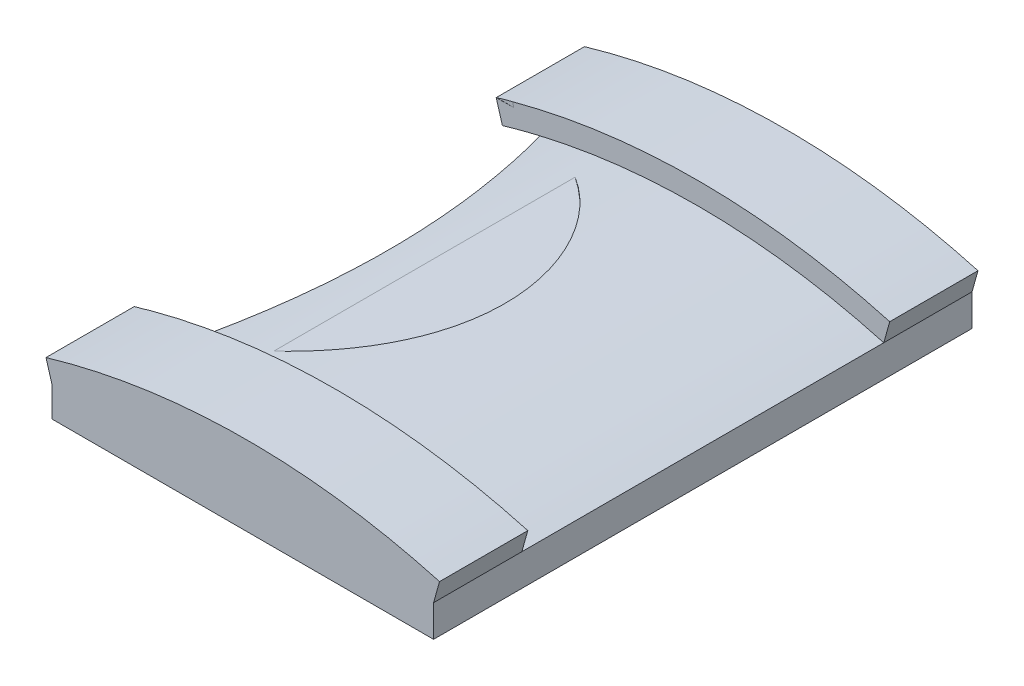
ISO-10303-21;
HEADER;
FILE_DESCRIPTION(('STEP AP214'),'2;1');
FILE_NAME('part.step','',(''),(''),'','','');
FILE_SCHEMA(('AUTOMOTIVE_DESIGN { 1 0 10303 214 1 1 1 1 }'));
ENDSEC;
DATA;
#1=APPLICATION_CONTEXT('core data for automotive mechanical design processes');
#2=APPLICATION_PROTOCOL_DEFINITION('international standard','automotive_design',2000,#1);
#3=PRODUCT_CONTEXT('',#1,'mechanical');
#4=PRODUCT('Part','Part','',(#3));
#5=PRODUCT_RELATED_PRODUCT_CATEGORY('part','',(#4));
#6=PRODUCT_DEFINITION_FORMATION('','',#4);
#7=PRODUCT_DEFINITION_CONTEXT('part definition',#1,'design');
#8=PRODUCT_DEFINITION('design','',#6,#7);
#9=PRODUCT_DEFINITION_SHAPE('','',#8);
#10=(LENGTH_UNIT() NAMED_UNIT(*) SI_UNIT(.MILLI.,.METRE.));
#11=(NAMED_UNIT(*) PLANE_ANGLE_UNIT() SI_UNIT($,.RADIAN.));
#12=(NAMED_UNIT(*) SI_UNIT($,.STERADIAN.) SOLID_ANGLE_UNIT());
#13=UNCERTAINTY_MEASURE_WITH_UNIT(LENGTH_MEASURE(1.E-05),#10,'distance_accuracy_value','');
#14=(GEOMETRIC_REPRESENTATION_CONTEXT(3) GLOBAL_UNCERTAINTY_ASSIGNED_CONTEXT((#13)) GLOBAL_UNIT_ASSIGNED_CONTEXT((#10,
#11,#12)) REPRESENTATION_CONTEXT('',''));
#15=CARTESIAN_POINT('',(0.,0.,0.));
#16=DIRECTION('',(0.,0.,1.));
#17=DIRECTION('',(1.,0.,0.));
#18=AXIS2_PLACEMENT_3D('',#15,#16,#17);
#19=CARTESIAN_POINT('',(-89.8245481772572,-2.61117872608306,610.));
#20=DIRECTION('',(0.,1.,0.));
#21=DIRECTION('',(0.,0.,1.));
#22=AXIS2_PLACEMENT_3D('',#19,#20,#21);
#23=PLANE('',#22);
#24=DIRECTION('',(1.,0.,0.));
#25=VECTOR('',#24,1.);
#26=CARTESIAN_POINT('',(-89.8245481772572,-2.61117872608306,610.));
#27=LINE('',#26,#25);
#28=CARTESIAN_POINT('',(-89.8245481772572,-2.61117872608307,610.));
#29=VERTEX_POINT('',#28);
#30=CARTESIAN_POINT('',(342.175451822743,-2.61117872608306,610.));
#31=VERTEX_POINT('',#30);
#32=EDGE_CURVE('E204',#29,#31,#27,.T.);
#33=ORIENTED_EDGE('',*,*,#32,.F.);
#34=CARTESIAN_POINT('',(-665.894968130585,-2.61117872608307,305.));
#35=DIRECTION('',(0.,1.,0.));
#36=DIRECTION('',(0.,0.,1.));
#37=AXIS2_PLACEMENT_3D('',#34,#35,#36);
#38=CIRCLE('',#37,651.829831125581);
#39=CARTESIAN_POINT('',(-89.8245481772572,-2.61117872608307,0.));
#40=VERTEX_POINT('',#39);
#41=EDGE_CURVE('E198',#29,#40,#38,.T.);
#42=ORIENTED_EDGE('',*,*,#41,.T.);
#43=DIRECTION('',(1.,0.,0.));
#44=VECTOR('',#43,1.);
#45=CARTESIAN_POINT('',(-89.8245481772572,-2.61117872608306,0.));
#46=LINE('',#45,#44);
#47=CARTESIAN_POINT('',(342.175451822743,-2.61117872608306,0.));
#48=VERTEX_POINT('',#47);
#49=EDGE_CURVE('E211',#40,#48,#46,.T.);
#50=ORIENTED_EDGE('',*,*,#49,.T.);
#51=DIRECTION('',(0.,0.,-1.));
#52=VECTOR('',#51,1.);
#53=CARTESIAN_POINT('',(342.175451822743,-2.61117872608306,610.));
#54=LINE('',#53,#52);
#55=EDGE_CURVE('E209',#31,#48,#54,.T.);
#56=ORIENTED_EDGE('',*,*,#55,.F.);
#57=EDGE_LOOP('',(#33,#42,#50,#56));
#58=FACE_BOUND('',#57,.T.);
#59=ADVANCED_FACE('F39',(#58),#23,.F.);
#60=CARTESIAN_POINT('',(342.175451822743,33.3888212739169,610.));
#61=DIRECTION('',(-1.,0.,0.));
#62=DIRECTION('',(0.,0.,1.));
#63=AXIS2_PLACEMENT_3D('',#60,#61,#62);
#64=PLANE('',#63);
#65=DIRECTION('',(0.,1.,0.));
#66=VECTOR('',#65,1.);
#67=CARTESIAN_POINT('',(342.175451822743,33.3888212739169,0.));
#68=LINE('',#67,#66);
#69=CARTESIAN_POINT('',(342.175451822743,33.3888212739169,0.));
#70=VERTEX_POINT('',#69);
#71=EDGE_CURVE('E205',#48,#70,#68,.T.);
#72=ORIENTED_EDGE('',*,*,#71,.T.);
#73=DIRECTION('',(0.,0.,1.));
#74=VECTOR('',#73,1.);
#75=CARTESIAN_POINT('',(342.175451822743,33.3888212739169,0.));
#76=LINE('',#75,#74);
#77=CARTESIAN_POINT('',(342.175451822743,33.3888212739169,100.));
#78=VERTEX_POINT('',#77);
#79=EDGE_CURVE('E195',#70,#78,#76,.T.);
#80=ORIENTED_EDGE('',*,*,#79,.T.);
#81=CARTESIAN_POINT('',(342.175451822743,33.3888212739169,510.));
#82=VERTEX_POINT('',#81);
#83=EDGE_CURVE('E192',#78,#82,#76,.T.);
#84=ORIENTED_EDGE('',*,*,#83,.T.);
#85=DIRECTION('',(0.,0.,1.));
#86=VECTOR('',#85,1.);
#87=CARTESIAN_POINT('',(342.175451822743,33.3888212739169,510.));
#88=LINE('',#87,#86);
#89=CARTESIAN_POINT('',(342.175451822743,33.3888212739169,610.));
#90=VERTEX_POINT('',#89);
#91=EDGE_CURVE('E177',#82,#90,#88,.T.);
#92=ORIENTED_EDGE('',*,*,#91,.T.);
#93=DIRECTION('',(0.,1.,0.));
#94=VECTOR('',#93,1.);
#95=CARTESIAN_POINT('',(342.175451822743,-2.61117872608306,610.));
#96=LINE('',#95,#94);
#97=EDGE_CURVE('E207',#31,#90,#96,.T.);
#98=ORIENTED_EDGE('',*,*,#97,.F.);
#99=ORIENTED_EDGE('',*,*,#55,.T.);
#100=EDGE_LOOP('',(#72,#80,#84,#92,#98,#99));
#101=FACE_BOUND('',#100,.T.);
#102=ADVANCED_FACE('F307',(#101),#64,.F.);
#103=CARTESIAN_POINT('',(0.,0.,610.));
#104=DIRECTION('',(0.,0.,1.));
#105=DIRECTION('',(1.,0.,0.));
#106=AXIS2_PLACEMENT_3D('',#103,#104,#105);
#107=PLANE('',#106);
#108=ORIENTED_EDGE('',*,*,#97,.T.);
#109=DIRECTION('',(0.269780541276789,0.962921834599467,0.));
#110=VECTOR('',#109,1.);
#111=CARTESIAN_POINT('',(348.919965354663,57.4618671389037,610.));
#112=LINE('',#111,#110);
#113=CARTESIAN_POINT('',(348.919965354663,57.4618671389037,610.));
#114=VERTEX_POINT('',#113);
#115=EDGE_CURVE('E185',#90,#114,#112,.T.);
#116=ORIENTED_EDGE('',*,*,#115,.T.);
#117=CARTESIAN_POINT('',(131.389708637557,-718.964160059342,610.));
#118=DIRECTION('',(0.,0.,1.));
#119=DIRECTION('',(-1.,0.,0.));
#120=AXIS2_PLACEMENT_3D('',#117,#118,#119);
#121=CIRCLE('',#120,806.32300494173);
#122=CARTESIAN_POINT('',(-96.902742964038,54.3658761089127,610.));
#123=VERTEX_POINT('',#122);
#124=EDGE_CURVE('E188',#114,#123,#121,.T.);
#125=ORIENTED_EDGE('',*,*,#124,.T.);
#126=DIRECTION('',(0.283127791471228,-0.959082193399828,0.));
#127=VECTOR('',#126,1.);
#128=CARTESIAN_POINT('',(-96.902742964038,54.3658761089127,610.));
#129=LINE('',#128,#127);
#130=CARTESIAN_POINT('',(-89.8245481772572,30.3888212739169,610.));
#131=VERTEX_POINT('',#130);
#132=EDGE_CURVE('E168',#123,#131,#129,.T.);
#133=ORIENTED_EDGE('',*,*,#132,.T.);
#134=DIRECTION('',(0.,-1.,0.));
#135=VECTOR('',#134,1.);
#136=CARTESIAN_POINT('',(-89.8245481772572,33.3888212739169,610.));
#137=LINE('',#136,#135);
#138=EDGE_CURVE('E202',#131,#29,#137,.T.);
#139=ORIENTED_EDGE('',*,*,#138,.T.);
#140=ORIENTED_EDGE('',*,*,#32,.T.);
#141=EDGE_LOOP('',(#108,#116,#125,#133,#139,#140));
#142=FACE_BOUND('',#141,.T.);
#143=ADVANCED_FACE('F312',(#142),#107,.T.);
#144=CARTESIAN_POINT('',(0.,0.,0.));
#145=DIRECTION('',(0.,0.,1.));
#146=DIRECTION('',(1.,0.,0.));
#147=AXIS2_PLACEMENT_3D('',#144,#145,#146);
#148=PLANE('',#147);
#149=DIRECTION('',(0.,-1.,0.));
#150=VECTOR('',#149,1.);
#151=CARTESIAN_POINT('',(-89.8245481772572,33.3888212739169,0.));
#152=LINE('',#151,#150);
#153=CARTESIAN_POINT('',(-89.8245481772572,30.388821273917,0.));
#154=VERTEX_POINT('',#153);
#155=EDGE_CURVE('E201',#154,#40,#152,.T.);
#156=ORIENTED_EDGE('',*,*,#155,.F.);
#157=DIRECTION('',(-0.283127791471227,0.959082193399828,0.));
#158=VECTOR('',#157,1.);
#159=CARTESIAN_POINT('',(-89.8245481772572,30.388821273917,0.));
#160=LINE('',#159,#158);
#161=CARTESIAN_POINT('',(-96.9027429640379,54.3658761089127,0.));
#162=VERTEX_POINT('',#161);
#163=EDGE_CURVE('E249',#154,#162,#160,.T.);
#164=ORIENTED_EDGE('',*,*,#163,.T.);
#165=CARTESIAN_POINT('',(131.389708637557,-718.964160059331,0.));
#166=DIRECTION('',(0.,0.,-1.));
#167=DIRECTION('',(1.,0.,0.));
#168=AXIS2_PLACEMENT_3D('',#165,#166,#167);
#169=CIRCLE('',#168,806.323004941719);
#170=CARTESIAN_POINT('',(348.919965354663,57.4618671389037,0.));
#171=VERTEX_POINT('',#170);
#172=EDGE_CURVE('E346',#162,#171,#169,.T.);
#173=ORIENTED_EDGE('',*,*,#172,.T.);
#174=DIRECTION('',(-0.269780541276791,-0.962921834599466,0.));
#175=VECTOR('',#174,1.);
#176=CARTESIAN_POINT('',(348.919965354663,57.4618671389037,0.));
#177=LINE('',#176,#175);
#178=EDGE_CURVE('E343',#171,#70,#177,.T.);
#179=ORIENTED_EDGE('',*,*,#178,.T.);
#180=ORIENTED_EDGE('',*,*,#71,.F.);
#181=ORIENTED_EDGE('',*,*,#49,.F.);
#182=EDGE_LOOP('',(#156,#164,#173,#179,#180,#181));
#183=FACE_BOUND('',#182,.T.);
#184=ADVANCED_FACE('F327',(#183),#148,.F.);
#185=CARTESIAN_POINT('',(-665.894968130585,-546.611178726083,305.));
#186=DIRECTION('',(0.,1.,0.));
#187=DIRECTION('',(0.,0.,1.));
#188=AXIS2_PLACEMENT_3D('',#185,#186,#187);
#189=CYLINDRICAL_SURFACE('',#188,651.829831125581);
#190=ORIENTED_EDGE('',*,*,#138,.F.);
#191=CARTESIAN_POINT('',(-89.8245481772573,30.388821273917,610.));
#192=CARTESIAN_POINT('',(-87.7670274310315,30.9962045677545,606.113875969285));
#193=CARTESIAN_POINT('',(-85.7475453875306,31.583168212301,602.20444718411));
#194=CARTESIAN_POINT('',(-81.7859853736655,32.7179611729695,594.340979217938));
#195=CARTESIAN_POINT('',(-79.8439068621288,33.2657907627213,590.386940349084));
#196=CARTESIAN_POINT('',(-76.038544657114,34.3240031996084,582.436390998146));
#197=CARTESIAN_POINT('',(-74.1752571215654,34.8343878735576,578.439882598915));
#198=CARTESIAN_POINT('',(-70.5286124537981,35.8193822972558,570.406278435235));
#199=CARTESIAN_POINT('',(-68.745255459662,36.2939919852033,566.369182600684));
#200=CARTESIAN_POINT('',(-63.517831279145,37.6663162573753,554.202364127327));
#201=CARTESIAN_POINT('',(-60.1950581372426,38.5128994606391,546.014284820514));
#202=CARTESIAN_POINT('',(-53.8817206385587,40.0817639930959,529.499604411659));
#203=CARTESIAN_POINT('',(-50.8911600808044,40.8040439008667,521.173001726781));
#204=CARTESIAN_POINT('',(-45.253260778214,42.1345698836475,504.409331189197));
#205=CARTESIAN_POINT('',(-42.6054145958622,42.7429851612326,495.972447499082));
#206=CARTESIAN_POINT('',(-37.6535989144778,43.8572078050147,478.991748524664));
#207=CARTESIAN_POINT('',(-35.3496284437111,44.3630154611648,470.447933542604));
#208=CARTESIAN_POINT('',(-31.0903200795063,45.2809741286341,453.268377019372));
#209=CARTESIAN_POINT('',(-29.1350014476571,45.6931199658658,444.632630427267));
#210=CARTESIAN_POINT('',(-25.577176773037,46.4313822043593,427.285133191634));
#211=CARTESIAN_POINT('',(-23.9746709120603,46.7574985612926,418.573382508946));
#212=CARTESIAN_POINT('',(-21.1262694021431,47.32992458623,401.092882548081));
#213=CARTESIAN_POINT('',(-19.8802268103644,47.5762671444792,392.324158284743));
#214=CARTESIAN_POINT('',(-17.7463113049515,47.9942924790657,374.74147729602));
#215=CARTESIAN_POINT('',(-16.8584383238481,48.1659752694669,365.927520579156));
#216=CARTESIAN_POINT('',(-15.4425810664872,48.438235417951,348.269743831603));
#217=CARTESIAN_POINT('',(-14.9145934065414,48.5388134445705,339.425924082476));
#218=CARTESIAN_POINT('',(-14.2195015608316,48.670988422831,321.723603031309));
#219=CARTESIAN_POINT('',(-14.0523973434685,48.7025853805121,312.865101730556));
#220=CARTESIAN_POINT('',(-14.0793894614111,48.6974709549842,295.148862758322));
#221=CARTESIAN_POINT('',(-14.2734779044289,48.660761064323,286.291125074386));
#222=CARTESIAN_POINT('',(-15.0224712908855,48.5182546426919,268.59146716632));
#223=CARTESIAN_POINT('',(-15.5773763840426,48.4124580830549,259.749546948756));
#224=CARTESIAN_POINT('',(-17.0469465592892,48.1295481551083,242.096746904372));
#225=CARTESIAN_POINT('',(-17.9616135352095,47.9524344113762,233.285867241199));
#226=CARTESIAN_POINT('',(-20.1489412448004,47.5232290702746,215.710490218211));
#227=CARTESIAN_POINT('',(-21.4216014415143,47.2711375853648,206.945992788846));
#228=CARTESIAN_POINT('',(-24.3095809655457,46.6894946269283,189.555991413942));
#229=CARTESIAN_POINT('',(-25.9217688880594,46.3606482378295,180.929943797826));
#230=CARTESIAN_POINT('',(-29.4921995180518,45.6180619931893,163.753445974169));
#231=CARTESIAN_POINT('',(-31.4504414716799,45.2043223225807,155.202995601989));
#232=CARTESIAN_POINT('',(-35.7088852884541,44.2844510172382,138.193251270943));
#233=CARTESIAN_POINT('',(-38.0090657857596,43.7783251547543,129.733951651968));
#234=CARTESIAN_POINT('',(-42.9466919166592,42.6649241570146,112.921016082648));
#235=CARTESIAN_POINT('',(-45.5841386302467,42.0576486978559,104.567380470755));
#236=CARTESIAN_POINT('',(-51.1945731518483,40.7311330957676,87.9690994947993));
#237=CARTESIAN_POINT('',(-54.1680400883225,40.0117325062748,79.7246289743764));
#238=CARTESIAN_POINT('',(-60.4407982930746,38.4506149465105,63.3720727451016));
#239=CARTESIAN_POINT('',(-63.7400858753715,37.6088993599272,55.2639854945716));
#240=CARTESIAN_POINT('',(-68.9276442281394,36.2456051853361,43.2152047479861));
#241=CARTESIAN_POINT('',(-70.6969374754253,35.7742941917437,39.2171350867238));
#242=CARTESIAN_POINT('',(-74.3139349363659,34.7965178874559,31.2608833503258));
#243=CARTESIAN_POINT('',(-76.1616390181227,34.290052635894,27.3027012081076));
#244=CARTESIAN_POINT('',(-79.9343439459667,33.2403451392832,19.4280530829188));
#245=CARTESIAN_POINT('',(-81.8593484770165,32.6971011401188,15.5115890999673));
#246=CARTESIAN_POINT('',(-85.7853076513413,31.5721919863455,7.72245949745522));
#247=CARTESIAN_POINT('',(-87.7862628113313,30.9905265703243,3.84979417610277));
#248=CARTESIAN_POINT('',(-89.8245481772572,30.3888212739169,1.52744912544088E-13));
#249=B_SPLINE_CURVE_WITH_KNOTS('',3,(#191,#192,#193,#194,#195,#196,#197,#198,#199,#200,#201,
#202,#203,#204,#205,#206,#207,#208,#209,#210,#211,#212,#213,#214,#215,#216,#217,#218,#219,#220,
#221,#222,#223,#224,#225,#226,#227,#228,#229,#230,#231,#232,#233,#234,#235,#236,#237,#238,#239,
#240,#241,#242,#243,#244,#245,#246,#247,#248),.UNSPECIFIED.,.F.,.F.,(4,2,2,2,2,2,2,2,2,2,2,2,2,
2,2,2,2,2,2,2,2,2,2,2,2,2,2,2,4),(0.,13.3165363844226,26.6329796489681,39.9487728155599,
53.264588984717,79.8867643393502,106.509244101348,133.091843223805,159.674367226935,
186.258359351145,212.842365173285,239.415396577907,265.988422976908,292.561199529444,
319.133973755266,345.706167355998,372.278371982681,398.85071649058,425.423021142632,
451.760219577979,478.097360640572,504.432856732646,530.768437158316,557.142054719575,
583.515373952542,596.706727444244,609.898058747132,623.090019637594,636.282070293012),.UNSPECIFIED.);
#250=CARTESIAN_POINT('',(-47.1404701710119,41.6885946886805,510.));
#251=VERTEX_POINT('',#250);
#252=EDGE_CURVE('E219',#131,#251,#249,.T.);
#253=ORIENTED_EDGE('',*,*,#252,.T.);
#254=CARTESIAN_POINT('',(-47.1404701710119,41.6885946886801,100.));
#255=VERTEX_POINT('',#254);
#256=EDGE_CURVE('E229',#251,#255,#249,.T.);
#257=ORIENTED_EDGE('',*,*,#256,.T.);
#258=EDGE_CURVE('E218',#255,#154,#249,.T.);
#259=ORIENTED_EDGE('',*,*,#258,.T.);
#260=ORIENTED_EDGE('',*,*,#155,.T.);
#261=ORIENTED_EDGE('',*,*,#41,.F.);
#262=EDGE_LOOP('',(#190,#253,#257,#259,#260,#261));
#263=FACE_BOUND('',#262,.T.);
#264=ADVANCED_FACE('F230',(#263),#189,.F.);
#265=CARTESIAN_POINT('',(131.389708637557,-718.964160059315,0.));
#266=DIRECTION('',(0.,0.,1.));
#267=DIRECTION('',(1.,0.,0.));
#268=AXIS2_PLACEMENT_3D('',#265,#266,#267);
#269=CYLINDRICAL_SURFACE('',#268,781.323004941704);
#270=DIRECTION('',(0.,0.,1.));
#271=VECTOR('',#270,1.);
#272=CARTESIAN_POINT('',(26.8316114314814,55.3311598024148,0.));
#273=LINE('',#272,#271);
#274=CARTESIAN_POINT('',(26.8316114314814,55.3311598024147,475.666427399295));
#275=VERTEX_POINT('',#274);
#276=CARTESIAN_POINT('',(26.8316114314814,55.3311598024147,134.333572600705));
#277=VERTEX_POINT('',#276);
#278=EDGE_CURVE('E141',#275,#277,#273,.F.);
#279=ORIENTED_EDGE('',*,*,#278,.T.);
#280=CARTESIAN_POINT('',(19.9150364328104,54.3656761089128,129.909174977745));
#281=CARTESIAN_POINT('',(22.1788123379352,54.6920112220515,131.293418577248));
#282=CARTESIAN_POINT('',(24.4167799901429,55.0044512575286,132.723110170417));
#283=CARTESIAN_POINT('',(28.837345579932,55.6025702743677,135.670880237915));
#284=CARTESIAN_POINT('',(31.019944451999,55.8882497076006,137.188957219093));
#285=CARTESIAN_POINT('',(35.3257044091558,56.4338379565738,140.310751974814));
#286=CARTESIAN_POINT('',(37.4488762319825,56.6937514497581,141.914454123682));
#287=CARTESIAN_POINT('',(41.632652521988,57.1890116364645,145.205113873037));
#288=CARTESIAN_POINT('',(43.6932567635858,57.4243582414207,146.892071773636));
#289=CARTESIAN_POINT('',(47.7467745622145,57.8715060478362,150.345048312508));
#290=CARTESIAN_POINT('',(49.7397430606426,58.0833266938669,152.110999941879));
#291=CARTESIAN_POINT('',(53.6565113999245,58.4849146554839,155.720416617031));
#292=CARTESIAN_POINT('',(55.5803111051449,58.6746819278274,157.563881814794));
#293=CARTESIAN_POINT('',(59.355702617917,59.0334851297347,161.325474857561));
#294=CARTESIAN_POINT('',(61.2072903415262,59.2025198879292,163.24360691312));
#295=CARTESIAN_POINT('',(64.8351481724146,59.5211926724865,167.151392088328));
#296=CARTESIAN_POINT('',(66.6114175804554,59.6708305187992,169.14104587165));
#297=CARTESIAN_POINT('',(70.1842774556156,59.9600500704249,173.303496099533));
#298=CARTESIAN_POINT('',(71.9763099716147,60.0985805763891,175.480280298342));
#299=CARTESIAN_POINT('',(75.4698617852609,60.3571324247925,179.906390722817));
#300=CARTESIAN_POINT('',(77.1713801891605,60.4771535844905,182.155717664428));
#301=CARTESIAN_POINT('',(80.4809133700942,60.7003084886724,186.723053852414));
#302=CARTESIAN_POINT('',(82.0889253639644,60.8034417306631,189.041065140042));
#303=CARTESIAN_POINT('',(85.2085346683646,60.9944154156851,193.741683621457));
#304=CARTESIAN_POINT('',(86.7201322084285,61.0822558951247,196.124290661442));
#305=CARTESIAN_POINT('',(89.6444119459957,61.2442178927159,200.950269706861));
#306=CARTESIAN_POINT('',(91.0570830632053,61.3183378756209,203.393648477655));
#307=CARTESIAN_POINT('',(93.7808365275743,61.4543624267841,208.336717505466));
#308=CARTESIAN_POINT('',(95.091918887971,61.516266996634,210.836407755147));
#309=CARTESIAN_POINT('',(97.6101913777736,61.6293135208904,215.887819008656));
#310=CARTESIAN_POINT('',(98.8173816048716,61.6804554854173,218.439539963556));
#311=CARTESIAN_POINT('',(101.125756555379,61.7733538669978,223.590660030208));
#312=CARTESIAN_POINT('',(102.226940965122,61.8151102562804,226.190059283012));
#313=CARTESIAN_POINT('',(104.339843002094,61.8911915544343,231.478329073538));
#314=CARTESIAN_POINT('',(105.349640598226,61.9253724354437,234.167969044848));
#315=CARTESIAN_POINT('',(107.255629016302,61.9866024540527,239.587291142207));
#316=CARTESIAN_POINT('',(108.151819470779,62.0136515685847,242.316973397743));
#317=CARTESIAN_POINT('',(109.828979061146,62.0617530087277,247.811600756003));
#318=CARTESIAN_POINT('',(110.609946666647,62.082805254692,250.576546326566));
#319=CARTESIAN_POINT('',(112.0552303886,62.1199190452055,256.136789478685));
#320=CARTESIAN_POINT('',(112.71954659824,62.1359805937415,258.932087035993));
#321=CARTESIAN_POINT('',(113.930395235543,62.1639838891103,264.548438918589));
#322=CARTESIAN_POINT('',(114.476913921379,62.1759251553835,267.369496208944));
#323=CARTESIAN_POINT('',(115.451078526767,62.1964095589081,273.032073487896));
#324=CARTESIAN_POINT('',(115.878724442883,62.2049526960611,275.873593477085));
#325=CARTESIAN_POINT('',(116.614367274972,62.2192132426191,281.572082082329));
#326=CARTESIAN_POINT('',(116.922364388528,62.2249306566903,284.429050672867));
#327=CARTESIAN_POINT('',(117.418151998776,62.2339551121418,290.153404069819));
#328=CARTESIAN_POINT('',(117.605942410398,62.2372621518163,293.020788883604));
#329=CARTESIAN_POINT('',(117.86151302807,62.241729843075,298.773018522017));
#330=CARTESIAN_POINT('',(117.928783971798,62.2428813873962,301.657885993406));
#331=CARTESIAN_POINT('',(117.941636067124,62.2431027270987,307.427893569998));
#332=CARTESIAN_POINT('',(117.887217120436,62.2421725207987,310.313033675421));
#333=CARTESIAN_POINT('',(117.656788439789,62.2381557474336,316.078465407829));
#334=CARTESIAN_POINT('',(117.480778179306,62.2350691710308,318.958757013766));
#335=CARTESIAN_POINT('',(117.00748846403,62.2264989906196,324.709355094126));
#336=CARTESIAN_POINT('',(116.710209036992,62.2210153871597,327.579661570834));
#337=CARTESIAN_POINT('',(115.994969005784,62.2072474608332,333.304832863546));
#338=CARTESIAN_POINT('',(115.577023272909,62.198963483072,336.159699538256));
#339=CARTESIAN_POINT('',(114.621200553059,62.1790301658533,341.84927328069));
#340=CARTESIAN_POINT('',(114.083323559826,62.1673808262202,344.683980347362));
#341=CARTESIAN_POINT('',(112.888623487723,62.1399974314325,350.328188055981));
#342=CARTESIAN_POINT('',(112.231800789522,62.1242633893504,353.137688778568));
#343=CARTESIAN_POINT('',(110.800408439352,62.0878428484552,358.726500926037));
#344=CARTESIAN_POINT('',(110.025838790592,62.067156349777,361.505812351742));
#345=CARTESIAN_POINT('',(108.360530865584,62.0198274027485,367.028766319328));
#346=CARTESIAN_POINT('',(107.469815373765,61.9931861218229,369.772415741271));
#347=CARTESIAN_POINT('',(105.573724945807,61.9328066671244,375.219725830994));
#348=CARTESIAN_POINT('',(104.568350012957,61.899068493555,377.92338649992));
#349=CARTESIAN_POINT('',(102.444765271299,61.8232354927301,383.285942897827));
#350=CARTESIAN_POINT('',(101.326554176316,61.7811405702139,385.94483811614));
#351=CARTESIAN_POINT('',(98.9793509536781,61.6872257700427,391.213099342341));
#352=CARTESIAN_POINT('',(97.7503588184081,61.6354058917192,393.822465346825));
#353=CARTESIAN_POINT('',(95.183125941725,61.5205439494845,398.988458475153));
#354=CARTESIAN_POINT('',(93.8448245496669,61.4574956322164,401.545055320791));
#355=CARTESIAN_POINT('',(91.0620251993601,61.3186455202271,406.599432806914));
#356=CARTESIAN_POINT('',(89.6175272043702,61.2428437210935,409.097213427049));
#357=CARTESIAN_POINT('',(86.6250523397339,61.0768702629199,414.029376662034));
#358=CARTESIAN_POINT('',(85.07707956537,60.9866991723866,416.463761780632));
#359=CARTESIAN_POINT('',(81.8804628933386,60.7903120171782,421.264847700262));
#360=CARTESIAN_POINT('',(80.2318190946984,60.6840959682859,423.631548567869));
#361=CARTESIAN_POINT('',(76.8380582561871,60.4539857622983,428.291412194154));
#362=CARTESIAN_POINT('',(75.0930069704401,60.3301035652887,430.584623429708));
#363=CARTESIAN_POINT('',(71.508657678722,60.0628788719176,435.095012329029));
#364=CARTESIAN_POINT('',(69.6693593878055,59.9195363167175,437.312189762882));
#365=CARTESIAN_POINT('',(65.8996403480989,59.6116332060641,441.666814339463));
#366=CARTESIAN_POINT('',(63.9692041982591,59.4470690562577,443.804247896526));
#367=CARTESIAN_POINT('',(60.0211538037798,59.0950246880414,447.995021759919));
#368=CARTESIAN_POINT('',(58.0035405967838,58.9075447423431,450.04836306661));
#369=CARTESIAN_POINT('',(53.8891654963973,58.5083904766369,454.063038456839));
#370=CARTESIAN_POINT('',(51.7925743852025,58.2967665567927,456.024552572266));
#371=CARTESIAN_POINT('',(47.520350189367,57.8473884584556,459.8563893916));
#372=CARTESIAN_POINT('',(45.3447175563132,57.609634429236,461.726712616364));
#373=CARTESIAN_POINT('',(40.919844038043,57.1065823414021,465.371615218237));
#374=CARTESIAN_POINT('',(38.6706448423113,56.8412997039518,467.146247362512));
#375=CARTESIAN_POINT('',(34.1020645236916,56.2816376007667,470.597336226846));
#376=CARTESIAN_POINT('',(31.7826950505324,55.9872629467187,472.2738091092));
#377=CARTESIAN_POINT('',(28.6511509675989,55.5750870027121,474.438313513756));
#378=CARTESIAN_POINT('',(27.8681167192884,55.4708262963396,474.971488568795));
#379=CARTESIAN_POINT('',(26.2950814400243,55.2589260227162,476.026557994389));
#380=CARTESIAN_POINT('',(25.5050814058348,55.1512869334265,476.548453943187));
#381=CARTESIAN_POINT('',(23.9190222980675,54.9326869493429,477.580380155619));
#382=CARTESIAN_POINT('',(23.1229704383169,54.8217296523174,478.090422276116));
#383=CARTESIAN_POINT('',(21.5240482808555,54.5963267410488,479.099171316643));
#384=CARTESIAN_POINT('',(20.7211770427328,54.4818806398648,479.597876637254));
#385=CARTESIAN_POINT('',(19.9150364328104,54.3656761089128,480.090825022255));
#386=B_SPLINE_CURVE_WITH_KNOTS('',3,(#280,#281,#282,#283,#284,#285,#286,#287,#288,#289,#290,
#291,#292,#293,#294,#295,#296,#297,#298,#299,#300,#301,#302,#303,#304,#305,#306,#307,#308,#309,
#310,#311,#312,#313,#314,#315,#316,#317,#318,#319,#320,#321,#322,#323,#324,#325,#326,#327,#328,
#329,#330,#331,#332,#333,#334,#335,#336,#337,#338,#339,#340,#341,#342,#343,#344,#345,#346,#347,
#348,#349,#350,#351,#352,#353,#354,#355,#356,#357,#358,#359,#360,#361,#362,#363,#364,#365,#366,
#367,#368,#369,#370,#371,#372,#373,#374,#375,#376,#377,#378,#379,#380,#381,#382,#383,#384,#385),
.UNSPECIFIED.,.F.,.F.,(4,2,2,2,2,2,2,2,2,2,2,2,2,2,2,2,2,2,2,2,2,2,2,2,2,2,2,2,2,2,2,2,2,2,2,2,
2,2,2,2,2,2,2,2,2,2,2,2,2,2,2,2,4),(0.,8.01976283416319,16.0393902247538,24.0575590884869,
32.0757568574747,40.0872773534709,48.0988135584304,56.1108022000232,64.1228652068484,
72.5891964549822,81.0556112852019,89.5222779844706,97.9889245263968,106.456517866708,
114.924110103663,123.391694378267,131.859303707276,140.476227678192,149.093179520179,
157.710245802153,166.327305200374,174.945369289764,183.563433628153,192.181483734936,
200.799539940784,209.453927134801,218.108321318761,226.762752978912,235.417182658323,
244.070546193552,252.723910180298,261.37724647364,270.030582531198,278.68222360318,
287.33386442711,295.985603878858,304.637343925289,313.29391746417,321.950493998014,
330.606728128018,339.262953743263,347.913346621861,356.563765655509,365.215651760724,
373.86743491337,382.50147712365,391.135470012913,399.764652098821,408.392409338411,
411.251472309738,414.110132598654,416.965798384976,419.821864585058),.UNSPECIFIED.);
#387=EDGE_CURVE('E159',#277,#275,#386,.T.);
#388=ORIENTED_EDGE('',*,*,#387,.T.);
#389=EDGE_LOOP('',(#279,#388));
#390=FACE_BOUND('',#389,.T.);
#391=ORIENTED_EDGE('',*,*,#83,.F.);
#392=CARTESIAN_POINT('',(131.389708637557,-718.964160059345,100.));
#393=DIRECTION('',(0.,0.,1.));
#394=DIRECTION('',(1.,0.,0.));
#395=AXIS2_PLACEMENT_3D('',#392,#393,#394);
#396=CIRCLE('',#395,781.323004941732);
#397=EDGE_CURVE('E256',#78,#255,#396,.T.);
#398=ORIENTED_EDGE('',*,*,#397,.T.);
#399=ORIENTED_EDGE('',*,*,#256,.F.);
#400=CARTESIAN_POINT('',(131.389708637557,-718.964160059315,510.));
#401=DIRECTION('',(0.,0.,-1.));
#402=DIRECTION('',(-1.,0.,0.));
#403=AXIS2_PLACEMENT_3D('',#400,#401,#402);
#404=CIRCLE('',#403,781.323004941704);
#405=EDGE_CURVE('E228',#251,#82,#404,.T.);
#406=ORIENTED_EDGE('',*,*,#405,.T.);
#407=EDGE_LOOP('',(#391,#398,#399,#406));
#408=FACE_BOUND('',#407,.T.);
#409=ADVANCED_FACE('F233',(#390,#408),#269,.T.);
#410=CARTESIAN_POINT('',(131.389708637557,-718.964160059342,510.));
#411=DIRECTION('',(0.,0.,1.));
#412=DIRECTION('',(1.,0.,0.));
#413=AXIS2_PLACEMENT_3D('',#410,#411,#412);
#414=CYLINDRICAL_SURFACE('',#413,781.32300494173);
#415=ORIENTED_EDGE('',*,*,#252,.F.);
#416=DIRECTION('',(0.,0.,1.));
#417=VECTOR('',#416,1.);
#418=CARTESIAN_POINT('',(-89.8245481772572,30.3888212739169,510.));
#419=LINE('',#418,#417);
#420=CARTESIAN_POINT('',(-89.8245481772572,30.3888212739169,510.));
#421=VERTEX_POINT('',#420);
#422=EDGE_CURVE('E169',#421,#131,#419,.T.);
#423=ORIENTED_EDGE('',*,*,#422,.F.);
#424=CARTESIAN_POINT('',(131.389708637557,-718.964160059342,510.));
#425=DIRECTION('',(0.,0.,-1.));
#426=DIRECTION('',(-1.,0.,0.));
#427=AXIS2_PLACEMENT_3D('',#424,#425,#426);
#428=CIRCLE('',#427,781.32300494173);
#429=EDGE_CURVE('E176',#421,#251,#428,.T.);
#430=ORIENTED_EDGE('',*,*,#429,.T.);
#431=EDGE_LOOP('',(#415,#423,#430));
#432=FACE_BOUND('',#431,.T.);
#433=ADVANCED_FACE('F237',(#432),#414,.F.);
#434=CARTESIAN_POINT('',(-96.902742964038,54.3658761089127,510.));
#435=DIRECTION('',(-0.959082193399828,-0.283127791471228,0.));
#436=DIRECTION('',(0.283127791471228,-0.959082193399828,0.));
#437=AXIS2_PLACEMENT_3D('',#434,#435,#436);
#438=PLANE('',#437);
#439=ORIENTED_EDGE('',*,*,#132,.F.);
#440=DIRECTION('',(0.,0.,1.));
#441=VECTOR('',#440,1.);
#442=CARTESIAN_POINT('',(-96.902742964038,54.3658761089127,510.));
#443=LINE('',#442,#441);
#444=CARTESIAN_POINT('',(-96.902742964038,54.3658761089128,510.));
#445=VERTEX_POINT('',#444);
#446=EDGE_CURVE('E155',#445,#123,#443,.T.);
#447=ORIENTED_EDGE('',*,*,#446,.F.);
#448=DIRECTION('',(0.283127791471228,-0.959082193399828,0.));
#449=VECTOR('',#448,1.);
#450=CARTESIAN_POINT('',(-96.902742964038,54.3658761089127,510.));
#451=LINE('',#450,#449);
#452=EDGE_CURVE('E166',#445,#421,#451,.T.);
#453=ORIENTED_EDGE('',*,*,#452,.T.);
#454=ORIENTED_EDGE('',*,*,#422,.T.);
#455=EDGE_LOOP('',(#439,#447,#453,#454));
#456=FACE_BOUND('',#455,.T.);
#457=ADVANCED_FACE('F164',(#456),#438,.T.);
#458=CARTESIAN_POINT('',(131.389708637557,-718.964160059342,510.));
#459=DIRECTION('',(0.,0.,1.));
#460=DIRECTION('',(1.,0.,0.));
#461=AXIS2_PLACEMENT_3D('',#458,#459,#460);
#462=CYLINDRICAL_SURFACE('',#461,806.32300494173);
#463=CARTESIAN_POINT('',(-96.902742964038,54.3658761089128,510.));
#464=CARTESIAN_POINT('',(-96.9026757194617,54.3658959599835,510.000003335022));
#465=CARTESIAN_POINT('',(-96.9026084748811,54.3659158110459,510.000006670008));
#466=CARTESIAN_POINT('',(-96.9024740237042,54.3659555019383,510.000013338023));
#467=CARTESIAN_POINT('',(-96.9024068171079,54.3659753417683,510.000016671053));
#468=CARTESIAN_POINT('',(-96.9020707841054,54.3660745408772,510.000033336022));
#469=CARTESIAN_POINT('',(-96.9018019576358,54.3661539000321,510.000046667423));
#470=CARTESIAN_POINT('',(-96.90045782495,54.3665506951442,510.000113321551));
#471=CARTESIAN_POINT('',(-96.8993825177195,54.3668681291147,510.000166635655));
#472=CARTESIAN_POINT('',(-96.8940059761579,54.3684552883732,510.000433160188));
#473=CARTESIAN_POINT('',(-96.8897047256054,54.3697249818762,510.000646232648));
#474=CARTESIAN_POINT('',(-96.8681983862015,54.3760732799048,510.001710859115));
#475=CARTESIAN_POINT('',(-96.8509930378691,54.3811513758398,510.002560205609));
#476=CARTESIAN_POINT('',(-96.7649649065237,54.4065391446834,510.006795165117));
#477=CARTESIAN_POINT('',(-96.6961379828599,54.4268406767137,510.010145457834));
#478=CARTESIAN_POINT('',(-96.3519808191166,54.5283050453801,510.026708563012));
#479=CARTESIAN_POINT('',(-96.0765847603856,54.6093374709864,510.039356210104));
#480=CARTESIAN_POINT('',(-94.6992273602939,55.0138113498386,510.099581568189));
#481=CARTESIAN_POINT('',(-93.5962510547885,55.3351537066476,510.138114876479));
#482=CARTESIAN_POINT('',(-90.2832902199616,56.2926723035721,510.224782582952));
#483=CARTESIAN_POINT('',(-88.0704632511597,56.9219852190022,510.243911773306));
#484=CARTESIAN_POINT('',(-84.7475284452667,57.8516528458971,510.214597022595));
#485=CARTESIAN_POINT('',(-83.6390780737346,58.1592097584155,510.19514906749));
#486=CARTESIAN_POINT('',(-81.4212396690311,58.7694778033098,510.136912854696));
#487=CARTESIAN_POINT('',(-80.3118515603586,59.0721884964771,510.098122854181));
#488=CARTESIAN_POINT('',(-76.9586824730527,59.9794431983161,509.951694597532));
#489=CARTESIAN_POINT('',(-74.7140617145476,60.5763482528649,509.814206856334));
#490=CARTESIAN_POINT('',(-70.2254105229398,61.7493046494452,509.46036240168));
#491=CARTESIAN_POINT('',(-67.9813801675599,62.3253539765239,509.243998089887));
#492=CARTESIAN_POINT('',(-63.4961667674768,63.456209279987,508.732592396678));
#493=CARTESIAN_POINT('',(-61.2549848300914,64.011008569757,508.437526479574));
#494=CARTESIAN_POINT('',(-56.7788527210006,65.0987749139405,507.769094166948));
#495=CARTESIAN_POINT('',(-54.5439029724384,65.6317405180165,507.395722579895));
#496=CARTESIAN_POINT('',(-50.0792458157681,66.6763889655684,506.570422728454));
#497=CARTESIAN_POINT('',(-47.8495546872743,67.1880324709477,506.118356595541));
#498=CARTESIAN_POINT('',(-43.4020851705301,68.188819263056,505.136649949394));
#499=CARTESIAN_POINT('',(-41.184307517446,68.677961175011,504.607004704579));
#500=CARTESIAN_POINT('',(-36.7639296086161,69.6334906697635,503.470891433288));
#501=CARTESIAN_POINT('',(-34.5613272384415,70.0998814799652,502.864434347268));
#502=CARTESIAN_POINT('',(-30.173775511269,71.0099209195985,501.575378146277));
#503=CARTESIAN_POINT('',(-27.9888261675655,71.4535695319042,500.892778973969));
#504=CARTESIAN_POINT('',(-23.6402965368313,72.3179627809291,499.452578670121));
#505=CARTESIAN_POINT('',(-21.4767074238276,72.7387172320343,498.695010075759));
#506=CARTESIAN_POINT('',(-17.1728122883623,73.5576150075763,497.105584931096));
#507=CARTESIAN_POINT('',(-15.0325048978864,73.9557596664113,496.273732772376));
#508=CARTESIAN_POINT('',(-10.7775206697326,74.7297001478787,494.536602900246));
#509=CARTESIAN_POINT('',(-8.66284669796299,75.1054934895725,493.631317062151));
#510=CARTESIAN_POINT('',(-4.46218055697326,75.8349319719499,491.748537367265));
#511=CARTESIAN_POINT('',(-2.37618660163298,76.1885784968033,490.771048031511));
#512=CARTESIAN_POINT('',(1.76136686853742,76.8735567659439,488.746558496227));
#513=CARTESIAN_POINT('',(3.8129752693828,77.2049226466599,487.699669748924));
#514=CARTESIAN_POINT('',(7.88252471785909,77.8463615210459,485.536242903508));
#515=CARTESIAN_POINT('',(9.90046570947369,78.1564344792911,484.419704689525));
#516=CARTESIAN_POINT('',(13.9000224878603,78.7557467218282,482.118345359486));
#517=CARTESIAN_POINT('',(15.8816403348145,79.0449871904436,480.933528131984));
#518=CARTESIAN_POINT('',(19.8061840267725,79.6032056150174,478.496948305019));
#519=CARTESIAN_POINT('',(21.7491100305697,79.8721836541465,477.24518598038));
#520=CARTESIAN_POINT('',(23.6714559135512,80.1313075340789,475.960643846323));
#521=B_SPLINE_CURVE_WITH_KNOTS('',3,(#463,#464,#465,#466,#467,#468,#469,#470,#471,#472,#473,
#474,#475,#476,#477,#478,#479,#480,#481,#482,#483,#484,#485,#486,#487,#488,#489,#490,#491,#492,
#493,#494,#495,#496,#497,#498,#499,#500,#501,#502,#503,#504,#505,#506,#507,#508,#509,#510,#511,
#512,#513,#514,#515,#516,#517,#518,#519,#520),.UNSPECIFIED.,.F.,.F.,(4,2,2,2,2,2,2,2,2,2,2,2,2,
2,2,2,2,2,2,2,2,2,2,2,2,2,2,2,4),(0.,0.000210578213103141,0.000421037450830538,
0.00126287440173894,0.00463022220549268,0.018099613427747,0.0719771787799771,0.287487469833339,
1.14953053135575,4.59782423192088,11.4981399619742,14.9494774516418,18.4011259823295,
25.3796634932884,32.3588734383541,39.3402617414285,46.3221130449315,53.3163215871642,
60.3109568867234,67.3045970451464,74.2982424700008,81.2888658127349,88.279076149019,
95.2700609382762,102.260608356055,109.240189209965,116.21978167544,123.198977038581,
130.178143752841),.UNSPECIFIED.);
#522=CARTESIAN_POINT('',(-78.13323183804,59.6608624725056,510.));
#523=VERTEX_POINT('',#522);
#524=EDGE_CURVE('E146',#445,#523,#521,.T.);
#525=ORIENTED_EDGE('',*,*,#524,.F.);
#526=ORIENTED_EDGE('',*,*,#446,.T.);
#527=ORIENTED_EDGE('',*,*,#124,.F.);
#528=DIRECTION('',(0.,0.,1.));
#529=VECTOR('',#528,1.);
#530=CARTESIAN_POINT('',(348.919965354663,57.4618671389037,510.));
#531=LINE('',#530,#529);
#532=CARTESIAN_POINT('',(348.919965354663,57.4618671389037,510.));
#533=VERTEX_POINT('',#532);
#534=EDGE_CURVE('E170',#533,#114,#531,.T.);
#535=ORIENTED_EDGE('',*,*,#534,.F.);
#536=CARTESIAN_POINT('',(131.389708637557,-718.964160059342,510.));
#537=DIRECTION('',(0.,0.,1.));
#538=DIRECTION('',(-1.,0.,0.));
#539=AXIS2_PLACEMENT_3D('',#536,#537,#538);
#540=CIRCLE('',#539,806.32300494173);
#541=EDGE_CURVE('E158',#533,#523,#540,.T.);
#542=ORIENTED_EDGE('',*,*,#541,.T.);
#543=EDGE_LOOP('',(#525,#526,#527,#535,#542));
#544=FACE_BOUND('',#543,.T.);
#545=ADVANCED_FACE('F153',(#544),#462,.T.);
#546=CARTESIAN_POINT('',(348.919965354663,57.4618671389037,510.));
#547=DIRECTION('',(0.962921834599467,-0.269780541276789,0.));
#548=DIRECTION('',(0.269780541276789,0.962921834599467,0.));
#549=AXIS2_PLACEMENT_3D('',#546,#547,#548);
#550=PLANE('',#549);
#551=ORIENTED_EDGE('',*,*,#115,.F.);
#552=ORIENTED_EDGE('',*,*,#91,.F.);
#553=DIRECTION('',(0.269780541276789,0.962921834599467,0.));
#554=VECTOR('',#553,1.);
#555=CARTESIAN_POINT('',(348.919965354663,57.4618671389037,510.));
#556=LINE('',#555,#554);
#557=EDGE_CURVE('E181',#82,#533,#556,.T.);
#558=ORIENTED_EDGE('',*,*,#557,.T.);
#559=ORIENTED_EDGE('',*,*,#534,.T.);
#560=EDGE_LOOP('',(#551,#552,#558,#559));
#561=FACE_BOUND('',#560,.T.);
#562=ADVANCED_FACE('F295',(#561),#550,.T.);
#563=CARTESIAN_POINT('',(131.389708637557,-718.964160059342,510.));
#564=DIRECTION('',(0.,0.,-1.));
#565=DIRECTION('',(-1.,0.,0.));
#566=AXIS2_PLACEMENT_3D('',#563,#564,#565);
#567=PLANE('',#566);
#568=CARTESIAN_POINT('',(-96.902742964038,54.3658761089127,510.));
#569=DIRECTION('',(0.,0.,-1.));
#570=DIRECTION('',(-1.,0.,0.));
#571=AXIS2_PLACEMENT_3D('',#568,#569,#570);
#572=CIRCLE('',#571,19.5020877984827);
#573=CARTESIAN_POINT('',(-77.4012485834464,54.5180123092144,510.));
#574=VERTEX_POINT('',#573);
#575=EDGE_CURVE('E147',#523,#574,#572,.T.);
#576=ORIENTED_EDGE('',*,*,#575,.F.);
#577=ORIENTED_EDGE('',*,*,#541,.F.);
#578=ORIENTED_EDGE('',*,*,#557,.F.);
#579=ORIENTED_EDGE('',*,*,#405,.F.);
#580=ORIENTED_EDGE('',*,*,#429,.F.);
#581=ORIENTED_EDGE('',*,*,#452,.F.);
#582=DIRECTION('',(-0.999969571571198,-0.00780102119699411,0.));
#583=VECTOR('',#582,1.);
#584=CARTESIAN_POINT('',(125.34323525082,56.0996744526731,510.));
#585=LINE('',#584,#583);
#586=EDGE_CURVE('E136',#574,#445,#585,.T.);
#587=ORIENTED_EDGE('',*,*,#586,.F.);
#588=EDGE_LOOP('',(#576,#577,#578,#579,#580,#581,#587));
#589=FACE_BOUND('',#588,.T.);
#590=ADVANCED_FACE('F173',(#589),#567,.T.);
#591=CARTESIAN_POINT('',(131.389708637557,-718.964160059345,100.));
#592=DIRECTION('',(0.,0.,-1.));
#593=DIRECTION('',(-1.,0.,0.));
#594=AXIS2_PLACEMENT_3D('',#591,#592,#593);
#595=CYLINDRICAL_SURFACE('',#594,781.323004941732);
#596=ORIENTED_EDGE('',*,*,#258,.F.);
#597=CARTESIAN_POINT('',(-89.8245481772572,30.388821273917,100.));
#598=VERTEX_POINT('',#597);
#599=EDGE_CURVE('E345',#255,#598,#396,.T.);
#600=ORIENTED_EDGE('',*,*,#599,.T.);
#601=DIRECTION('',(0.,0.,-1.));
#602=VECTOR('',#601,1.);
#603=CARTESIAN_POINT('',(-89.8245481772572,30.388821273917,100.));
#604=LINE('',#603,#602);
#605=EDGE_CURVE('E337',#598,#154,#604,.T.);
#606=ORIENTED_EDGE('',*,*,#605,.T.);
#607=EDGE_LOOP('',(#596,#600,#606));
#608=FACE_BOUND('',#607,.T.);
#609=ADVANCED_FACE('F289',(#608),#595,.F.);
#610=CARTESIAN_POINT('',(348.919965354663,57.4618671389037,100.));
#611=DIRECTION('',(0.962921834599466,-0.269780541276791,0.));
#612=DIRECTION('',(0.269780541276791,0.962921834599466,0.));
#613=AXIS2_PLACEMENT_3D('',#610,#611,#612);
#614=PLANE('',#613);
#615=ORIENTED_EDGE('',*,*,#178,.F.);
#616=DIRECTION('',(0.,0.,-1.));
#617=VECTOR('',#616,1.);
#618=CARTESIAN_POINT('',(348.919965354663,57.4618671389037,100.));
#619=LINE('',#618,#617);
#620=CARTESIAN_POINT('',(348.919965354663,57.4618671389037,100.));
#621=VERTEX_POINT('',#620);
#622=EDGE_CURVE('E189',#621,#171,#619,.T.);
#623=ORIENTED_EDGE('',*,*,#622,.F.);
#624=DIRECTION('',(-0.269780541276791,-0.962921834599466,0.));
#625=VECTOR('',#624,1.);
#626=CARTESIAN_POINT('',(348.919965354663,57.4618671389037,100.));
#627=LINE('',#626,#625);
#628=EDGE_CURVE('E340',#621,#78,#627,.T.);
#629=ORIENTED_EDGE('',*,*,#628,.T.);
#630=ORIENTED_EDGE('',*,*,#79,.F.);
#631=EDGE_LOOP('',(#615,#623,#629,#630));
#632=FACE_BOUND('',#631,.T.);
#633=ADVANCED_FACE('F284',(#632),#614,.T.);
#634=CARTESIAN_POINT('',(131.389708637557,-718.964160059331,100.));
#635=DIRECTION('',(0.,0.,-1.));
#636=DIRECTION('',(-1.,0.,0.));
#637=AXIS2_PLACEMENT_3D('',#634,#635,#636);
#638=CYLINDRICAL_SURFACE('',#637,806.323004941719);
#639=CARTESIAN_POINT('',(-96.902742964038,54.3658761089127,100.));
#640=CARTESIAN_POINT('',(-96.9026757194569,54.3658959599848,99.9999966649779));
#641=CARTESIAN_POINT('',(-96.9026084748715,54.3659158110486,99.9999933299918));
#642=CARTESIAN_POINT('',(-96.9024740236851,54.3659555019439,99.9999866619757));
#643=CARTESIAN_POINT('',(-96.9024068170841,54.3659753417754,99.9999833289457));
#644=CARTESIAN_POINT('',(-96.9020707840578,54.3660745408915,99.9999666639753));
#645=CARTESIAN_POINT('',(-96.9018019575691,54.3661539000519,99.9999533325739));
#646=CARTESIAN_POINT('',(-96.9004578247877,54.3665506951919,99.9998866784413));
#647=CARTESIAN_POINT('',(-96.899382517481,54.3668681291851,99.999833364333));
#648=CARTESIAN_POINT('',(-96.8940059755378,54.3684552885567,99.9995668397812));
#649=CARTESIAN_POINT('',(-96.8897047246799,54.3697249821496,99.9993537673065));
#650=CARTESIAN_POINT('',(-96.8681983837492,54.3760732806281,99.9982891407636));
#651=CARTESIAN_POINT('',(-96.8509930341956,54.3811513769239,99.9974397942094));
#652=CARTESIAN_POINT('',(-96.7649648967437,54.4065391475703,99.9932048344027));
#653=CARTESIAN_POINT('',(-96.6961379681936,54.4268406810401,99.9898545414526));
#654=CARTESIAN_POINT('',(-96.3519807800158,54.5283050568984,99.9732914351361));
#655=CARTESIAN_POINT('',(-96.0765847017281,54.6093374882413,99.960643787217));
#656=CARTESIAN_POINT('',(-94.6992272037973,55.0138113956776,99.9004184254258));
#657=CARTESIAN_POINT('',(-93.5962508198675,55.3351537750303,99.8618851155428));
#658=CARTESIAN_POINT('',(-90.2832897491454,56.2926724386775,99.7752174083979));
#659=CARTESIAN_POINT('',(-88.0704626225098,56.9219853973004,99.7560882230912));
#660=CARTESIAN_POINT('',(-84.7475275795689,57.851653086886,99.7854029896189));
#661=CARTESIAN_POINT('',(-83.6390771289333,58.1592100199614,99.804850951373));
#662=CARTESIAN_POINT('',(-81.4212385659855,58.7694781052565,99.8630871802139));
#663=CARTESIAN_POINT('',(-80.3118503781721,59.0721888182673,99.9018771901275));
#664=CARTESIAN_POINT('',(-76.958681048256,59.9794435799166,100.048305479477));
#665=CARTESIAN_POINT('',(-74.7140601263504,60.5763486732676,100.185793248342));
#666=CARTESIAN_POINT('',(-70.225408608743,61.749305144273,100.539637769744));
#667=CARTESIAN_POINT('',(-67.9813780907643,62.3253545069741,100.75600212062));
#668=CARTESIAN_POINT('',(-63.4961643667808,63.4562098784434,101.267407903348));
#669=CARTESIAN_POINT('',(-61.2549822680945,64.0110092005953,101.562473870894));
#670=CARTESIAN_POINT('',(-56.7788498384395,65.0987756062104,102.230906295636));
#671=CARTESIAN_POINT('',(-54.5438999306143,65.6317412393355,102.604277944365));
#672=CARTESIAN_POINT('',(-50.0792424572194,66.6763897418032,103.429577930474));
#673=CARTESIAN_POINT('',(-47.8495511712714,67.1880332730371,103.881644136419));
#674=CARTESIAN_POINT('',(-43.4020813429016,68.1888201134583,104.863350939636));
#675=CARTESIAN_POINT('',(-41.1843035356465,68.6779620478714,105.392996268491));
#676=CARTESIAN_POINT('',(-36.763925322464,69.6334915841441,106.52910971864));
#677=CARTESIAN_POINT('',(-34.5613228021069,70.0998824134091,107.135566899476));
#678=CARTESIAN_POINT('',(-30.1737707790885,71.009921887833,108.424623300675));
#679=CARTESIAN_POINT('',(-27.9888212897216,71.4535705158661,109.107222578375));
#680=CARTESIAN_POINT('',(-23.640291373113,72.3179637930179,110.547423103198));
#681=CARTESIAN_POINT('',(-21.4767021198935,72.7387182565268,111.304991813128));
#682=CARTESIAN_POINT('',(-17.1728067097002,73.5576160537058,112.894417198948));
#683=CARTESIAN_POINT('',(-15.0324991847115,73.9557607217744,113.726269483256));
#684=CARTESIAN_POINT('',(-10.7775146937221,74.7297012186641,115.46339961633));
#685=CARTESIAN_POINT('',(-8.66284059363081,75.1054945665455,116.368685589786));
#686=CARTESIAN_POINT('',(-4.46217420281727,75.8349330583734,118.251465564809));
#687=CARTESIAN_POINT('',(-2.37618012597416,76.1885795864898,119.228955045339));
#688=CARTESIAN_POINT('',(1.76137357931111,76.8735578593198,121.253444878851));
#689=CARTESIAN_POINT('',(3.81298209378572,77.2049237404705,122.30033377958));
#690=CARTESIAN_POINT('',(7.88253176171452,77.8463626131374,124.463760940542));
#691=CARTESIAN_POINT('',(9.90047285915239,78.1564355692287,125.580299316643));
#692=CARTESIAN_POINT('',(13.9000298408581,78.7557478050454,127.881658979223));
#693=CARTESIAN_POINT('',(15.8816477853089,79.0449882690945,129.066476377147));
#694=CARTESIAN_POINT('',(19.8061916634791,79.6032066823191,131.503056552881));
#695=CARTESIAN_POINT('',(21.7491177559919,79.8721847146652,132.754819055867));
#696=CARTESIAN_POINT('',(23.6714637230615,80.1313085868029,134.03936137204));
#697=B_SPLINE_CURVE_WITH_KNOTS('',3,(#639,#640,#641,#642,#643,#644,#645,#646,#647,#648,#649,
#650,#651,#652,#653,#654,#655,#656,#657,#658,#659,#660,#661,#662,#663,#664,#665,#666,#667,#668,
#669,#670,#671,#672,#673,#674,#675,#676,#677,#678,#679,#680,#681,#682,#683,#684,#685,#686,#687,
#688,#689,#690,#691,#692,#693,#694,#695,#696),.UNSPECIFIED.,.F.,.F.,(4,2,2,2,2,2,2,2,2,2,2,2,2,
2,2,2,2,2,2,2,2,2,2,2,2,2,2,2,4),(0.,0.0002105782280374,0.000421037480703391,
0.00126287449137882,0.0046302225341713,0.0180996147125468,0.071977183889218,0.287487490240332,
1.14953061295415,4.59782455831071,11.4981407787579,14.949478513858,18.4011272900447,
25.3796653083421,32.358875760893,39.3402645719281,46.3221163834927,53.316325436569,
60.3109612470653,67.3046019162059,74.2982478517796,81.2888717041105,88.2790825499029,
95.2700678488431,102.260615776211,109.240197137631,116.219790110619,123.198985981188,
130.17815320287),.UNSPECIFIED.);
#698=CARTESIAN_POINT('',(-78.1332318380345,59.6608624725071,100.));
#699=VERTEX_POINT('',#698);
#700=CARTESIAN_POINT('',(-96.9027429640379,54.3658761089127,100.));
#701=VERTEX_POINT('',#700);
#702=EDGE_CURVE('E271',#699,#701,#697,.F.);
#703=ORIENTED_EDGE('',*,*,#702,.F.);
#704=CARTESIAN_POINT('',(131.389708637557,-718.964160059331,100.));
#705=DIRECTION('',(0.,0.,-1.));
#706=DIRECTION('',(1.,0.,0.));
#707=AXIS2_PLACEMENT_3D('',#704,#705,#706);
#708=CIRCLE('',#707,806.323004941719);
#709=EDGE_CURVE('E351',#699,#621,#708,.T.);
#710=ORIENTED_EDGE('',*,*,#709,.T.);
#711=ORIENTED_EDGE('',*,*,#622,.T.);
#712=ORIENTED_EDGE('',*,*,#172,.F.);
#713=DIRECTION('',(0.,0.,-1.));
#714=VECTOR('',#713,1.);
#715=CARTESIAN_POINT('',(-96.9027429640379,54.3658761089127,100.));
#716=LINE('',#715,#714);
#717=EDGE_CURVE('E339',#701,#162,#716,.T.);
#718=ORIENTED_EDGE('',*,*,#717,.F.);
#719=EDGE_LOOP('',(#703,#710,#711,#712,#718));
#720=FACE_BOUND('',#719,.T.);
#721=ADVANCED_FACE('F279',(#720),#638,.T.);
#722=CARTESIAN_POINT('',(-89.8245481772572,30.388821273917,100.));
#723=DIRECTION('',(-0.959082193399828,-0.283127791471227,0.));
#724=DIRECTION('',(0.283127791471227,-0.959082193399828,0.));
#725=AXIS2_PLACEMENT_3D('',#722,#723,#724);
#726=PLANE('',#725);
#727=ORIENTED_EDGE('',*,*,#163,.F.);
#728=ORIENTED_EDGE('',*,*,#605,.F.);
#729=DIRECTION('',(-0.283127791471227,0.959082193399828,0.));
#730=VECTOR('',#729,1.);
#731=CARTESIAN_POINT('',(-89.8245481772572,30.388821273917,100.));
#732=LINE('',#731,#730);
#733=EDGE_CURVE('E352',#598,#701,#732,.T.);
#734=ORIENTED_EDGE('',*,*,#733,.T.);
#735=ORIENTED_EDGE('',*,*,#717,.T.);
#736=EDGE_LOOP('',(#727,#728,#734,#735));
#737=FACE_BOUND('',#736,.T.);
#738=ADVANCED_FACE('F283',(#737),#726,.T.);
#739=CARTESIAN_POINT('',(131.389708637557,-718.964160059345,100.));
#740=DIRECTION('',(0.,0.,1.));
#741=DIRECTION('',(1.,0.,0.));
#742=AXIS2_PLACEMENT_3D('',#739,#740,#741);
#743=PLANE('',#742);
#744=CARTESIAN_POINT('',(-96.902742964038,54.3658761089127,100.));
#745=DIRECTION('',(0.,0.,1.));
#746=DIRECTION('',(1.,0.,0.));
#747=AXIS2_PLACEMENT_3D('',#744,#745,#746);
#748=CIRCLE('',#747,19.5020877984834);
#749=CARTESIAN_POINT('',(-77.4012485834461,54.5180123092143,99.9999999999999));
#750=VERTEX_POINT('',#749);
#751=EDGE_CURVE('E11',#750,#699,#748,.T.);
#752=ORIENTED_EDGE('',*,*,#751,.F.);
#753=DIRECTION('',(0.999969571571198,0.00780102119699411,0.));
#754=VECTOR('',#753,1.);
#755=CARTESIAN_POINT('',(125.34323525082,56.0996744526731,100.));
#756=LINE('',#755,#754);
#757=EDGE_CURVE('E46',#701,#750,#756,.T.);
#758=ORIENTED_EDGE('',*,*,#757,.F.);
#759=ORIENTED_EDGE('',*,*,#733,.F.);
#760=ORIENTED_EDGE('',*,*,#599,.F.);
#761=ORIENTED_EDGE('',*,*,#397,.F.);
#762=ORIENTED_EDGE('',*,*,#628,.F.);
#763=ORIENTED_EDGE('',*,*,#709,.F.);
#764=EDGE_LOOP('',(#752,#758,#759,#760,#761,#762,#763));
#765=FACE_BOUND('',#764,.T.);
#766=ADVANCED_FACE('F266',(#765),#743,.T.);
#767=CARTESIAN_POINT('',(-87.1519957737415,54.4419442090636,305.));
#768=DIRECTION('',(0.00780102119699411,-0.999969571571197,0.));
#769=DIRECTION('',(0.999969571571197,0.00780102119699411,0.));
#770=AXIS2_PLACEMENT_3D('',#767,#768,#769);
#771=PLANE('',#770);
#772=ORIENTED_EDGE('',*,*,#757,.T.);
#773=CARTESIAN_POINT('',(-87.1519957737415,54.4419442090636,305.));
#774=DIRECTION('',(-0.00780102119699411,0.999969571571197,0.));
#775=DIRECTION('',(0.999969571571197,0.00780102119699411,0.));
#776=AXIS2_PLACEMENT_3D('',#773,#774,#775);
#777=CIRCLE('',#776,205.231778380262);
#778=EDGE_CURVE('E149',#750,#701,#777,.T.);
#779=ORIENTED_EDGE('',*,*,#778,.T.);
#780=EDGE_LOOP('',(#772,#779));
#781=FACE_BOUND('',#780,.T.);
#782=ADVANCED_FACE('F263',(#781),#771,.F.);
#783=CARTESIAN_POINT('',(-96.902742964038,44.6148322096713,305.));
#784=DIRECTION('',(-1.,0.,0.));
#785=DIRECTION('',(0.,-1.,0.));
#786=AXIS2_PLACEMENT_3D('',#783,#784,#785);
#787=CIRCLE('',#786,205.231778380262);
#788=TRIMMED_CURVE('',#787,(PARAMETER_VALUE(-1.61832656998484)),
(PARAMETER_VALUE(1.61832656998484)),.T.,.PARAMETER.);
#789=CARTESIAN_POINT('',(-96.902742964038,54.3658761089127,305.));
#790=DIRECTION('',(0.,0.,1.));
#791=AXIS1_PLACEMENT('',#789,#790);
#792=SURFACE_OF_REVOLUTION('',#788,#791);
#793=ORIENTED_EDGE('',*,*,#702,.T.);
#794=ORIENTED_EDGE('',*,*,#778,.F.);
#795=ORIENTED_EDGE('',*,*,#751,.T.);
#796=EDGE_LOOP('',(#793,#794,#795));
#797=FACE_BOUND('',#796,.T.);
#798=ADVANCED_FACE('F258',(#797),#792,.F.);
#799=ORIENTED_EDGE('',*,*,#586,.T.);
#800=EDGE_CURVE('E59',#445,#574,#777,.T.);
#801=ORIENTED_EDGE('',*,*,#800,.T.);
#802=EDGE_LOOP('',(#799,#801));
#803=FACE_BOUND('',#802,.T.);
#804=ADVANCED_FACE('F137',(#803),#771,.F.);
#805=ORIENTED_EDGE('',*,*,#524,.T.);
#806=ORIENTED_EDGE('',*,*,#575,.T.);
#807=ORIENTED_EDGE('',*,*,#800,.F.);
#808=EDGE_LOOP('',(#805,#806,#807));
#809=FACE_BOUND('',#808,.T.);
#810=ADVANCED_FACE('F145',(#809),#792,.F.);
#811=CARTESIAN_POINT('',(-96.902742964038,54.3658761089127,305.));
#812=DIRECTION('',(0.,0.,1.));
#813=DIRECTION('',(0.,-1.,0.));
#814=AXIS2_PLACEMENT_3D('',#811,#812,#813);
#815=DEGENERATE_TOROIDAL_SURFACE('',#814,9.75104389924147,205.231778380262,.T.);
#816=EDGE_CURVE('E52',#275,#277,#777,.T.);
#817=ORIENTED_EDGE('',*,*,#816,.F.);
#818=ORIENTED_EDGE('',*,*,#387,.F.);
#819=EDGE_LOOP('',(#817,#818));
#820=FACE_BOUND('',#819,.T.);
#821=ADVANCED_FACE('F265',(#820),#815,.F.);
#822=ORIENTED_EDGE('',*,*,#816,.T.);
#823=ORIENTED_EDGE('',*,*,#278,.F.);
#824=EDGE_LOOP('',(#822,#823));
#825=FACE_BOUND('',#824,.T.);
#826=ADVANCED_FACE('F455',(#825),#771,.F.);
#827=CLOSED_SHELL('',(#59,#102,#143,#184,#264,#409,#433,#457,#545,#562,#590,#609,#633,#721,#738,
#766,#782,#798,#804,#810,#821,#826));
#828=MANIFOLD_SOLID_BREP('B2',#827);
#829=ADVANCED_BREP_SHAPE_REPRESENTATION('',(#18,#828),#14);
#830=SHAPE_DEFINITION_REPRESENTATION(#9,#829);
ENDSEC;
END-ISO-10303-21;
